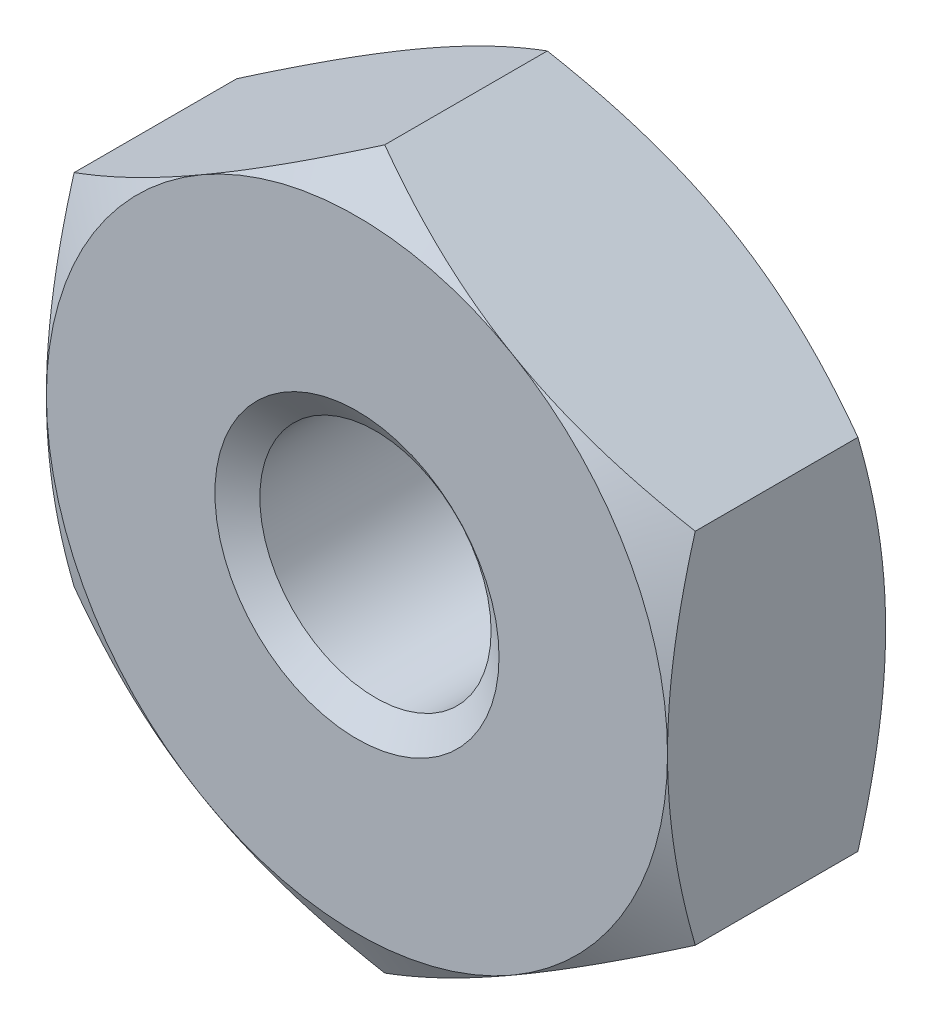
ISO-10303-21;
HEADER;
FILE_DESCRIPTION(('STEP AP214'),'2;1');
FILE_NAME('part.step','',(''),(''),'','','');
FILE_SCHEMA(('AUTOMOTIVE_DESIGN { 1 0 10303 214 1 1 1 1 }'));
ENDSEC;
DATA;
#1=APPLICATION_CONTEXT('core data for automotive mechanical design processes');
#2=APPLICATION_PROTOCOL_DEFINITION('international standard','automotive_design',2000,#1);
#3=PRODUCT_CONTEXT('',#1,'mechanical');
#4=PRODUCT('Part','Part','',(#3));
#5=PRODUCT_RELATED_PRODUCT_CATEGORY('part','',(#4));
#6=PRODUCT_DEFINITION_FORMATION('','',#4);
#7=PRODUCT_DEFINITION_CONTEXT('part definition',#1,'design');
#8=PRODUCT_DEFINITION('design','',#6,#7);
#9=PRODUCT_DEFINITION_SHAPE('','',#8);
#10=(LENGTH_UNIT() NAMED_UNIT(*) SI_UNIT(.MILLI.,.METRE.));
#11=(NAMED_UNIT(*) PLANE_ANGLE_UNIT() SI_UNIT($,.RADIAN.));
#12=(NAMED_UNIT(*) SI_UNIT($,.STERADIAN.) SOLID_ANGLE_UNIT());
#13=UNCERTAINTY_MEASURE_WITH_UNIT(LENGTH_MEASURE(1.E-05),#10,'distance_accuracy_value','');
#14=(GEOMETRIC_REPRESENTATION_CONTEXT(3) GLOBAL_UNCERTAINTY_ASSIGNED_CONTEXT((#13)) GLOBAL_UNIT_ASSIGNED_CONTEXT((#10,
#11,#12)) REPRESENTATION_CONTEXT('',''));
#15=CARTESIAN_POINT('',(0.,0.,0.));
#16=DIRECTION('',(0.,0.,1.));
#17=DIRECTION('',(1.,0.,0.));
#18=AXIS2_PLACEMENT_3D('',#15,#16,#17);
#19=CARTESIAN_POINT('',(0.,0.,-1.6764));
#20=DIRECTION('',(0.,0.,1.));
#21=DIRECTION('',(1.,0.,0.));
#22=AXIS2_PLACEMENT_3D('',#19,#20,#21);
#23=CYLINDRICAL_SURFACE('',#22,0.889);
#24=CARTESIAN_POINT('',(0.,0.,-0.14228217176421));
#25=DIRECTION('',(0.,0.,1.));
#26=DIRECTION('',(1.,0.,0.));
#27=AXIS2_PLACEMENT_3D('',#24,#25,#26);
#28=CIRCLE('',#27,0.889);
#29=CARTESIAN_POINT('',(0.889,0.,-0.14228217176421));
#30=VERTEX_POINT('',#29);
#31=EDGE_CURVE('E173',#30,#30,#28,.F.);
#32=ORIENTED_EDGE('',*,*,#31,.F.);
#33=EDGE_LOOP('',(#32));
#34=FACE_BOUND('',#33,.T.);
#35=CARTESIAN_POINT('',(0.,0.,-1.50871782823579));
#36=DIRECTION('',(0.,0.,-1.));
#37=DIRECTION('',(-1.,0.,0.));
#38=AXIS2_PLACEMENT_3D('',#35,#36,#37);
#39=CIRCLE('',#38,0.889);
#40=CARTESIAN_POINT('',(-0.889,0.,-1.50871782823579));
#41=VERTEX_POINT('',#40);
#42=EDGE_CURVE('E38',#41,#41,#39,.F.);
#43=ORIENTED_EDGE('',*,*,#42,.F.);
#44=EDGE_LOOP('',(#43));
#45=FACE_BOUND('',#44,.T.);
#46=ADVANCED_FACE('F33',(#34,#45),#23,.F.);
#47=CARTESIAN_POINT('',(0.,2.75696300543431,-1.6764));
#48=DIRECTION('',(0.,0.,-1.));
#49=DIRECTION('',(-1.,0.,0.));
#50=AXIS2_PLACEMENT_3D('',#47,#48,#49);
#51=PLANE('',#50);
#52=CARTESIAN_POINT('',(0.,0.,-1.6764));
#53=DIRECTION('',(0.,0.,-1.));
#54=DIRECTION('',(-1.,0.,0.));
#55=AXIS2_PLACEMENT_3D('',#52,#53,#54);
#56=CIRCLE('',#55,2.3876);
#57=CARTESIAN_POINT('',(-2.3876,0.,-1.6764));
#58=VERTEX_POINT('',#57);
#59=CARTESIAN_POINT('',(-1.1938,-2.06772225407572,-1.6764));
#60=VERTEX_POINT('',#59);
#61=EDGE_CURVE('E169',#58,#60,#56,.F.);
#62=ORIENTED_EDGE('',*,*,#61,.F.);
#63=CARTESIAN_POINT('',(-1.19380000000001,2.06772225407572,-1.6764));
#64=VERTEX_POINT('',#63);
#65=EDGE_CURVE('E151',#64,#58,#56,.F.);
#66=ORIENTED_EDGE('',*,*,#65,.F.);
#67=CARTESIAN_POINT('',(1.19380000000001,2.06772225407572,-1.6764));
#68=VERTEX_POINT('',#67);
#69=EDGE_CURVE('E168',#68,#64,#56,.F.);
#70=ORIENTED_EDGE('',*,*,#69,.F.);
#71=CARTESIAN_POINT('',(0.,0.,-1.6764));
#72=DIRECTION('',(0.,0.,1.));
#73=DIRECTION('',(1.,0.,0.));
#74=AXIS2_PLACEMENT_3D('',#71,#72,#73);
#75=CIRCLE('',#74,2.3876);
#76=CARTESIAN_POINT('',(2.3876,0.,-1.6764));
#77=VERTEX_POINT('',#76);
#78=EDGE_CURVE('E243',#77,#68,#75,.T.);
#79=ORIENTED_EDGE('',*,*,#78,.F.);
#80=CARTESIAN_POINT('',(1.19380000000001,-2.06772225407572,-1.6764));
#81=VERTEX_POINT('',#80);
#82=EDGE_CURVE('E375',#81,#77,#56,.F.);
#83=ORIENTED_EDGE('',*,*,#82,.F.);
#84=EDGE_CURVE('E396',#60,#81,#56,.F.);
#85=ORIENTED_EDGE('',*,*,#84,.F.);
#86=EDGE_LOOP('',(#62,#66,#70,#79,#83,#85));
#87=FACE_BOUND('',#86,.T.);
#88=CARTESIAN_POINT('',(0.,0.,-1.6764));
#89=DIRECTION('',(0.,0.,-1.));
#90=DIRECTION('',(-1.,0.,0.));
#91=AXIS2_PLACEMENT_3D('',#88,#89,#90);
#92=CIRCLE('',#91,1.0922);
#93=CARTESIAN_POINT('',(-1.0922,0.,-1.6764));
#94=VERTEX_POINT('',#93);
#95=EDGE_CURVE('E176',#94,#94,#92,.F.);
#96=ORIENTED_EDGE('',*,*,#95,.T.);
#97=EDGE_LOOP('',(#96));
#98=FACE_BOUND('',#97,.T.);
#99=ADVANCED_FACE('F248',(#87,#98),#51,.T.);
#100=CARTESIAN_POINT('',(0.,2.75696300543431,0.));
#101=DIRECTION('',(0.,0.,-1.));
#102=DIRECTION('',(-1.,0.,0.));
#103=AXIS2_PLACEMENT_3D('',#100,#101,#102);
#104=PLANE('',#103);
#105=CARTESIAN_POINT('',(0.,0.,0.));
#106=DIRECTION('',(0.,0.,-1.));
#107=DIRECTION('',(-1.,0.,0.));
#108=AXIS2_PLACEMENT_3D('',#105,#106,#107);
#109=CIRCLE('',#108,2.3876);
#110=CARTESIAN_POINT('',(-2.3876,0.,0.));
#111=VERTEX_POINT('',#110);
#112=CARTESIAN_POINT('',(-1.19380000000001,2.06772225407572,0.));
#113=VERTEX_POINT('',#112);
#114=EDGE_CURVE('E11',#111,#113,#109,.T.);
#115=ORIENTED_EDGE('',*,*,#114,.F.);
#116=CARTESIAN_POINT('',(-1.1938,-2.06772225407572,0.));
#117=VERTEX_POINT('',#116);
#118=EDGE_CURVE('E45',#117,#111,#109,.T.);
#119=ORIENTED_EDGE('',*,*,#118,.F.);
#120=CARTESIAN_POINT('',(1.19380000000001,-2.06772225407572,0.));
#121=VERTEX_POINT('',#120);
#122=EDGE_CURVE('E172',#121,#117,#109,.T.);
#123=ORIENTED_EDGE('',*,*,#122,.F.);
#124=CARTESIAN_POINT('',(2.3876,0.,0.));
#125=VERTEX_POINT('',#124);
#126=EDGE_CURVE('E341',#125,#121,#109,.T.);
#127=ORIENTED_EDGE('',*,*,#126,.F.);
#128=CARTESIAN_POINT('',(0.,0.,0.));
#129=DIRECTION('',(0.,0.,1.));
#130=DIRECTION('',(1.,0.,0.));
#131=AXIS2_PLACEMENT_3D('',#128,#129,#130);
#132=CIRCLE('',#131,2.3876);
#133=CARTESIAN_POINT('',(1.19380000000001,2.06772225407572,0.));
#134=VERTEX_POINT('',#133);
#135=EDGE_CURVE('E127',#125,#134,#132,.T.);
#136=ORIENTED_EDGE('',*,*,#135,.T.);
#137=EDGE_CURVE('E43',#113,#134,#109,.T.);
#138=ORIENTED_EDGE('',*,*,#137,.F.);
#139=EDGE_LOOP('',(#115,#119,#123,#127,#136,#138));
#140=FACE_BOUND('',#139,.T.);
#141=CARTESIAN_POINT('',(0.,0.,0.));
#142=DIRECTION('',(0.,0.,1.));
#143=DIRECTION('',(1.,0.,0.));
#144=AXIS2_PLACEMENT_3D('',#141,#142,#143);
#145=CIRCLE('',#144,1.0922);
#146=CARTESIAN_POINT('',(1.0922,0.,0.));
#147=VERTEX_POINT('',#146);
#148=EDGE_CURVE('E175',#147,#147,#145,.T.);
#149=ORIENTED_EDGE('',*,*,#148,.F.);
#150=EDGE_LOOP('',(#149));
#151=FACE_BOUND('',#150,.T.);
#152=ADVANCED_FACE('F300',(#140,#151),#104,.F.);
#153=CARTESIAN_POINT('',(0.,2.75696300543431,-1.6764));
#154=DIRECTION('',(-0.500000000000004,0.866025403784436,0.));
#155=DIRECTION('',(-0.866025403784436,-0.500000000000004,0.));
#156=AXIS2_PLACEMENT_3D('',#153,#154,#155);
#157=PLANE('',#156);
#158=DIRECTION('',(0.,0.,1.));
#159=VECTOR('',#158,1.);
#160=CARTESIAN_POINT('',(-2.3876,1.37848150271714,-1.6764));
#161=LINE('',#160,#159);
#162=CARTESIAN_POINT('',(-2.3876,1.37848150271716,-1.46314816938381));
#163=VERTEX_POINT('',#162);
#164=CARTESIAN_POINT('',(-2.3876,1.37848150271714,-0.213251830616181));
#165=VERTEX_POINT('',#164);
#166=EDGE_CURVE('E163',#163,#165,#161,.T.);
#167=ORIENTED_EDGE('',*,*,#166,.T.);
#168=CARTESIAN_POINT('',(-2.3878,1.3783660326633,-0.213318501470979));
#169=CARTESIAN_POINT('',(-2.28287606453564,1.43894389504809,-0.178329367585888));
#170=CARTESIAN_POINT('',(-2.17704643460647,1.50004466037593,-0.146507745229369));
#171=CARTESIAN_POINT('',(-1.96355453037943,1.62330426875122,-0.0909621397075383));
#172=CARTESIAN_POINT('',(-1.85588846194031,1.68546530234714,-0.0672578076475622));
#173=CARTESIAN_POINT('',(-1.64189067804026,1.80901698048781,-0.0303576796709481));
#174=CARTESIAN_POINT('',(-1.53559189340191,1.8703886124133,-0.0169163088441156));
#175=CARTESIAN_POINT('',(-1.32249401746025,1.99342072845196,-0.000868578218158919));
#176=CARTESIAN_POINT('',(-1.21569570098293,2.05508076521913,0.00175106886924208));
#177=CARTESIAN_POINT('',(-1.01612814269019,2.17030114872096,-0.00369159153788402));
#178=CARTESIAN_POINT('',(-0.923329063406968,2.22387872212568,-0.0104175391417704));
#179=CARTESIAN_POINT('',(-0.738335505406029,2.33068480263587,-0.0317370557583221));
#180=CARTESIAN_POINT('',(-0.646141666797156,2.38391294017433,-0.0463379112564599));
#181=CARTESIAN_POINT('',(-0.460766524191895,2.49093932865855,-0.0828397901525214));
#182=CARTESIAN_POINT('',(-0.367608688702193,2.54472403005565,-0.104895581600362));
#183=CARTESIAN_POINT('',(-0.182682641216108,2.65149113335191,-0.154953888652165));
#184=CARTESIAN_POINT('',(-0.0909120590697554,2.7044749036578,-0.182944638241838));
#185=CARTESIAN_POINT('',(0.000199999999998261,2.75707847548814,-0.213318501470984));
#186=B_SPLINE_CURVE_WITH_KNOTS('',3,(#168,#169,#170,#171,#172,#173,#174,#175,#176,#177,#178,
#179,#180,#181,#182,#183,#184,#185),.UNSPECIFIED.,.F.,.F.,(4,2,2,2,2,2,2,2,4),(0.,
0.378469527554648,0.757848917720108,1.12783830118146,1.49737326355505,1.81916504067612,
2.14125507699893,2.47049068028368,2.79907957904289),.UNSPECIFIED.);
#187=EDGE_CURVE('E132',#165,#113,#186,.T.);
#188=ORIENTED_EDGE('',*,*,#187,.T.);
#189=CARTESIAN_POINT('',(0.,2.75696300543431,-0.213251830616187));
#190=VERTEX_POINT('',#189);
#191=EDGE_CURVE('E52',#113,#190,#186,.T.);
#192=ORIENTED_EDGE('',*,*,#191,.T.);
#193=DIRECTION('',(0.,0.,1.));
#194=VECTOR('',#193,1.);
#195=CARTESIAN_POINT('',(0.,2.75696300543431,-1.6764));
#196=LINE('',#195,#194);
#197=CARTESIAN_POINT('',(0.,2.75696300543431,-1.46314816938381));
#198=VERTEX_POINT('',#197);
#199=EDGE_CURVE('E148',#198,#190,#196,.T.);
#200=ORIENTED_EDGE('',*,*,#199,.F.);
#201=CARTESIAN_POINT('',(-2.3878,1.3783660326633,-1.46308149852902));
#202=CARTESIAN_POINT('',(-2.28287606453564,1.43894389504809,-1.49807063241411));
#203=CARTESIAN_POINT('',(-2.17704643460647,1.50004466037593,-1.52989225477063));
#204=CARTESIAN_POINT('',(-1.96355453037943,1.62330426875122,-1.58543786029246));
#205=CARTESIAN_POINT('',(-1.85588846194031,1.68546530234714,-1.60914219235244));
#206=CARTESIAN_POINT('',(-1.64189067804026,1.80901698048781,-1.64604232032905));
#207=CARTESIAN_POINT('',(-1.53559189340191,1.8703886124133,-1.65948369115588));
#208=CARTESIAN_POINT('',(-1.32249401746025,1.99342072845196,-1.67553142178184));
#209=CARTESIAN_POINT('',(-1.21569570098293,2.05508076521913,-1.67815106886924));
#210=CARTESIAN_POINT('',(-1.01612814269019,2.17030114872096,-1.67270840846212));
#211=CARTESIAN_POINT('',(-0.923329063406969,2.22387872212568,-1.66598246085823));
#212=CARTESIAN_POINT('',(-0.73833550540603,2.33068480263587,-1.64466294424168));
#213=CARTESIAN_POINT('',(-0.646141666797157,2.38391294017433,-1.63006208874354));
#214=CARTESIAN_POINT('',(-0.460766524191895,2.49093932865855,-1.59356020984748));
#215=CARTESIAN_POINT('',(-0.367608688702193,2.54472403005565,-1.57150441839964));
#216=CARTESIAN_POINT('',(-0.182682641216109,2.65149113335191,-1.52144611134783));
#217=CARTESIAN_POINT('',(-0.0909120590697563,2.7044749036578,-1.49345536175816));
#218=CARTESIAN_POINT('',(0.000199999999997863,2.75707847548814,-1.46308149852902));
#219=B_SPLINE_CURVE_WITH_KNOTS('',3,(#201,#202,#203,#204,#205,#206,#207,#208,#209,#210,#211,
#212,#213,#214,#215,#216,#217,#218),.UNSPECIFIED.,.F.,.F.,(4,2,2,2,2,2,2,2,4),(0.,
0.378469527554648,0.757848917720108,1.12783830118146,1.49737326355505,1.81916504067612,
2.14125507699893,2.47049068028368,2.79907957904288),.UNSPECIFIED.);
#220=EDGE_CURVE('E166',#64,#198,#219,.T.);
#221=ORIENTED_EDGE('',*,*,#220,.F.);
#222=EDGE_CURVE('E258',#163,#64,#219,.T.);
#223=ORIENTED_EDGE('',*,*,#222,.F.);
#224=EDGE_LOOP('',(#167,#188,#192,#200,#221,#223));
#225=FACE_BOUND('',#224,.T.);
#226=ADVANCED_FACE('F35',(#225),#157,.T.);
#227=CARTESIAN_POINT('',(2.3876,1.37848150271715,-1.6764));
#228=DIRECTION('',(0.500000000000003,0.866025403784437,0.));
#229=DIRECTION('',(-0.866025403784437,0.500000000000003,0.));
#230=AXIS2_PLACEMENT_3D('',#227,#228,#229);
#231=PLANE('',#230);
#232=ORIENTED_EDGE('',*,*,#199,.T.);
#233=CARTESIAN_POINT('',(-0.000200000000001865,2.75707847548814,-0.213318501470985));
#234=CARTESIAN_POINT('',(0.104723935464362,2.69650061310336,-0.178329367585893));
#235=CARTESIAN_POINT('',(0.21055356539353,2.63539984777552,-0.146507745229374));
#236=CARTESIAN_POINT('',(0.424045469620568,2.51214023940023,-0.0909621397075422));
#237=CARTESIAN_POINT('',(0.531711538059694,2.44997920580431,-0.0672578076475657));
#238=CARTESIAN_POINT('',(0.745709321959737,2.32642752766364,-0.0303576796709507));
#239=CARTESIAN_POINT('',(0.852008106598094,2.26505589573815,-0.0169163088441176));
#240=CARTESIAN_POINT('',(1.06510598253976,2.14202377969949,-0.000868578218159751));
#241=CARTESIAN_POINT('',(1.17190429901707,2.08036374293232,0.00175106886924188));
#242=CARTESIAN_POINT('',(1.37147185730981,1.96514335943049,-0.00369159153788347));
#243=CARTESIAN_POINT('',(1.46427093659303,1.91156578602577,-0.0104175391417696));
#244=CARTESIAN_POINT('',(1.64926449459397,1.80475970551558,-0.0317370557583205));
#245=CARTESIAN_POINT('',(1.74145833320285,1.75153156797712,-0.0463379112564577));
#246=CARTESIAN_POINT('',(1.92683347580811,1.64450517949291,-0.0828397901525183));
#247=CARTESIAN_POINT('',(2.01999131129781,1.5907204780958,-0.104895581600359));
#248=CARTESIAN_POINT('',(2.20491735878389,1.48395337479954,-0.154953888652161));
#249=CARTESIAN_POINT('',(2.29668794093025,1.43096960449365,-0.182944638241834));
#250=CARTESIAN_POINT('',(2.3878,1.37836603266331,-0.213318501470979));
#251=B_SPLINE_CURVE_WITH_KNOTS('',3,(#233,#234,#235,#236,#237,#238,#239,#240,#241,#242,#243,
#244,#245,#246,#247,#248,#249,#250),.UNSPECIFIED.,.F.,.F.,(4,2,2,2,2,2,2,2,4),(0.,
0.378469527554649,0.757848917720111,1.12783830118146,1.49737326355505,1.81916504067612,
2.14125507699893,2.47049068028368,2.79907957904288),.UNSPECIFIED.);
#252=EDGE_CURVE('E142',#190,#134,#251,.T.);
#253=ORIENTED_EDGE('',*,*,#252,.T.);
#254=CARTESIAN_POINT('',(2.3876,1.37848150271717,-0.213251830616187));
#255=VERTEX_POINT('',#254);
#256=EDGE_CURVE('E59',#134,#255,#251,.T.);
#257=ORIENTED_EDGE('',*,*,#256,.T.);
#258=DIRECTION('',(0.,0.,1.));
#259=VECTOR('',#258,1.);
#260=CARTESIAN_POINT('',(2.3876,1.37848150271715,-1.6764));
#261=LINE('',#260,#259);
#262=CARTESIAN_POINT('',(2.3876,1.37848150271717,-1.46314816938381));
#263=VERTEX_POINT('',#262);
#264=EDGE_CURVE('E141',#263,#255,#261,.T.);
#265=ORIENTED_EDGE('',*,*,#264,.F.);
#266=CARTESIAN_POINT('',(-0.000200000000001872,2.75707847548814,-1.46308149852902));
#267=CARTESIAN_POINT('',(0.104723935464362,2.69650061310336,-1.49807063241411));
#268=CARTESIAN_POINT('',(0.21055356539353,2.63539984777552,-1.52989225477063));
#269=CARTESIAN_POINT('',(0.424045469620568,2.51214023940023,-1.58543786029246));
#270=CARTESIAN_POINT('',(0.531711538059694,2.44997920580431,-1.60914219235243));
#271=CARTESIAN_POINT('',(0.745709321959737,2.32642752766364,-1.64604232032905));
#272=CARTESIAN_POINT('',(0.852008106598094,2.26505589573815,-1.65948369115588));
#273=CARTESIAN_POINT('',(1.06510598253976,2.14202377969949,-1.67553142178184));
#274=CARTESIAN_POINT('',(1.17190429901707,2.08036374293232,-1.67815106886924));
#275=CARTESIAN_POINT('',(1.37147185730981,1.96514335943049,-1.67270840846212));
#276=CARTESIAN_POINT('',(1.46427093659303,1.91156578602577,-1.66598246085823));
#277=CARTESIAN_POINT('',(1.64926449459397,1.80475970551558,-1.64466294424168));
#278=CARTESIAN_POINT('',(1.74145833320285,1.75153156797712,-1.63006208874354));
#279=CARTESIAN_POINT('',(1.92683347580811,1.64450517949291,-1.59356020984748));
#280=CARTESIAN_POINT('',(2.01999131129781,1.5907204780958,-1.57150441839964));
#281=CARTESIAN_POINT('',(2.20491735878389,1.48395337479954,-1.52144611134784));
#282=CARTESIAN_POINT('',(2.29668794093025,1.43096960449365,-1.49345536175817));
#283=CARTESIAN_POINT('',(2.3878,1.37836603266331,-1.46308149852902));
#284=B_SPLINE_CURVE_WITH_KNOTS('',3,(#266,#267,#268,#269,#270,#271,#272,#273,#274,#275,#276,
#277,#278,#279,#280,#281,#282,#283),.UNSPECIFIED.,.F.,.F.,(4,2,2,2,2,2,2,2,4),(0.,
0.378469527554649,0.757848917720111,1.12783830118146,1.49737326355505,1.81916504067612,
2.14125507699893,2.47049068028368,2.79907957904288),.UNSPECIFIED.);
#285=EDGE_CURVE('E252',#68,#263,#284,.T.);
#286=ORIENTED_EDGE('',*,*,#285,.F.);
#287=EDGE_CURVE('E257',#198,#68,#284,.T.);
#288=ORIENTED_EDGE('',*,*,#287,.F.);
#289=EDGE_LOOP('',(#232,#253,#257,#265,#286,#288));
#290=FACE_BOUND('',#289,.T.);
#291=ADVANCED_FACE('F139',(#290),#231,.T.);
#292=CARTESIAN_POINT('',(2.3876,1.37848150271715,-1.6764));
#293=DIRECTION('',(-1.,0.,0.));
#294=DIRECTION('',(0.,0.,1.));
#295=AXIS2_PLACEMENT_3D('',#292,#293,#294);
#296=PLANE('',#295);
#297=CARTESIAN_POINT('',(2.3876,-3.65593609080649,-1.14253036159854));
#298=CARTESIAN_POINT('',(2.3876,-3.55110694918386,-1.09187113002077));
#299=CARTESIAN_POINT('',(2.3876,-3.44602995685677,-1.04171549313264));
#300=CARTESIAN_POINT('',(2.3876,-3.23524625803962,-0.942699180123231));
#301=CARTESIAN_POINT('',(2.3876,-3.12953944635139,-0.893838728210004));
#302=CARTESIAN_POINT('',(2.3876,-2.91679107639573,-0.797443156999656));
#303=CARTESIAN_POINT('',(2.3876,-2.80974534161061,-0.74991722213313));
#304=CARTESIAN_POINT('',(2.3876,-2.59477405010642,-0.656906706437378));
#305=CARTESIAN_POINT('',(2.3876,-2.48684853959578,-0.61142201920174));
#306=CARTESIAN_POINT('',(2.3876,-2.26860623456078,-0.522496803220397));
#307=CARTESIAN_POINT('',(2.3876,-2.15827634925912,-0.47908822594844));
#308=CARTESIAN_POINT('',(2.3876,-1.93631522811917,-0.39567082225968));
#309=CARTESIAN_POINT('',(2.3876,-1.82468384906324,-0.355662374089448));
#310=CARTESIAN_POINT('',(2.3876,-1.60017141965676,-0.280120244638395));
#311=CARTESIAN_POINT('',(2.3876,-1.487293603322,-0.244577050022474));
#312=CARTESIAN_POINT('',(2.3876,-1.2599332647214,-0.179119755521417));
#313=CARTESIAN_POINT('',(2.3876,-1.14545126227174,-0.149203875516054));
#314=CARTESIAN_POINT('',(2.3876,-0.914804359975561,-0.0964535455080679));
#315=CARTESIAN_POINT('',(2.3876,-0.798639020636922,-0.073620981027459));
#316=CARTESIAN_POINT('',(2.3876,-0.564907787073333,-0.0365745914220466));
#317=CARTESIAN_POINT('',(2.3876,-0.447341891610209,-0.0223607739172987));
#318=CARTESIAN_POINT('',(2.3876,-0.212169292608925,-0.00380930426889783));
#319=CARTESIAN_POINT('',(2.3876,-0.0945676495920211,0.000590871764266419));
#320=CARTESIAN_POINT('',(2.3876,0.140553287899092,-0.000718707219114432));
#321=CARTESIAN_POINT('',(2.3876,0.25807259582575,-0.00642583790168169));
#322=CARTESIAN_POINT('',(2.3876,0.458753843166105,-0.024400516690851));
#323=CARTESIAN_POINT('',(2.3876,0.542137181712102,-0.0343272988086084));
#324=CARTESIAN_POINT('',(2.3876,0.708259747560009,-0.0586235846359388));
#325=CARTESIAN_POINT('',(2.3876,0.790998871167442,-0.0729937890101849));
#326=CARTESIAN_POINT('',(2.3876,1.03818247230877,-0.122015355850191));
#327=CARTESIAN_POINT('',(2.3876,1.20146831776594,-0.162565050307172));
#328=CARTESIAN_POINT('',(2.3876,1.44580075224368,-0.232502314876436));
#329=CARTESIAN_POINT('',(2.3876,1.52812092254202,-0.257690051867363));
#330=CARTESIAN_POINT('',(2.3876,1.69190206167627,-0.310557865937949));
#331=CARTESIAN_POINT('',(2.3876,1.773363580432,-0.338236223967965));
#332=CARTESIAN_POINT('',(2.3876,1.93508677044203,-0.39550934184071));
#333=CARTESIAN_POINT('',(2.3876,2.01535261438467,-0.425092437982261));
#334=CARTESIAN_POINT('',(2.3876,2.17526154662173,-0.485994997377667));
#335=CARTESIAN_POINT('',(2.3876,2.25490436816689,-0.517315162412031));
#336=CARTESIAN_POINT('',(2.3876,2.33425921925151,-0.549332446004792));
#337=B_SPLINE_CURVE_WITH_KNOTS('',3,(#297,#298,#299,#300,#301,#302,#303,#304,#305,#306,#307,
#308,#309,#310,#311,#312,#313,#314,#315,#316,#317,#318,#319,#320,#321,#322,#323,#324,#325,#326,
#327,#328,#329,#330,#331,#332,#333,#334,#335,#336),.UNSPECIFIED.,.F.,.F.,(4,2,2,2,2,2,2,2,2,2,2,
2,2,2,2,2,2,2,2,4),(0.,0.349289042962513,0.698638161244703,1.04998646344191,1.40131642918613,
1.75695963655398,2.1126423557206,2.46755394737998,2.82235307834569,3.17724657312797,
3.53214038168024,3.88476658086275,4.23730123505986,4.48909473258754,4.74092795464398,
5.24496920192682,5.50321076764731,5.76127544014718,6.01788755129246,6.27460410049568),.UNSPECIFIED.);
#338=CARTESIAN_POINT('',(2.3876,-1.37848150271716,-0.213251830616187));
#339=VERTEX_POINT('',#338);
#340=EDGE_CURVE('E134',#339,#125,#337,.T.);
#341=ORIENTED_EDGE('',*,*,#340,.F.);
#342=DIRECTION('',(0.,0.,1.));
#343=VECTOR('',#342,1.);
#344=CARTESIAN_POINT('',(2.3876,-1.37848150271716,-1.6764));
#345=LINE('',#344,#343);
#346=CARTESIAN_POINT('',(2.3876,-1.37848150271716,-1.46314816938381));
#347=VERTEX_POINT('',#346);
#348=EDGE_CURVE('E149',#347,#339,#345,.T.);
#349=ORIENTED_EDGE('',*,*,#348,.F.);
#350=CARTESIAN_POINT('',(2.3876,-3.65593609080648,-0.533869638401462));
#351=CARTESIAN_POINT('',(2.3876,-3.55110694918386,-0.584528869979238));
#352=CARTESIAN_POINT('',(2.3876,-3.44602995685677,-0.634684506867364));
#353=CARTESIAN_POINT('',(2.3876,-3.23524625803961,-0.733700819876772));
#354=CARTESIAN_POINT('',(2.3876,-3.12953944635139,-0.782561271789999));
#355=CARTESIAN_POINT('',(2.3876,-2.91679107639573,-0.878956843000347));
#356=CARTESIAN_POINT('',(2.3876,-2.80974534161061,-0.926482777866872));
#357=CARTESIAN_POINT('',(2.3876,-2.59477405010642,-1.01949329356262));
#358=CARTESIAN_POINT('',(2.3876,-2.48684853959578,-1.06497798079826));
#359=CARTESIAN_POINT('',(2.3876,-2.26860623456078,-1.1539031967796));
#360=CARTESIAN_POINT('',(2.3876,-2.15827634925912,-1.19731177405156));
#361=CARTESIAN_POINT('',(2.3876,-1.93631522811917,-1.28072917774032));
#362=CARTESIAN_POINT('',(2.3876,-1.82468384906324,-1.32073762591055));
#363=CARTESIAN_POINT('',(2.3876,-1.60017141965676,-1.39627975536161));
#364=CARTESIAN_POINT('',(2.3876,-1.487293603322,-1.43182294997753));
#365=CARTESIAN_POINT('',(2.3876,-1.2599332647214,-1.49728024447858));
#366=CARTESIAN_POINT('',(2.3876,-1.14545126227174,-1.52719612448395));
#367=CARTESIAN_POINT('',(2.3876,-0.914804359975561,-1.57994645449193));
#368=CARTESIAN_POINT('',(2.3876,-0.798639020636922,-1.60277901897254));
#369=CARTESIAN_POINT('',(2.3876,-0.564907787073333,-1.63982540857795));
#370=CARTESIAN_POINT('',(2.3876,-0.447341891610209,-1.6540392260827));
#371=CARTESIAN_POINT('',(2.3876,-0.212169292608925,-1.6725906957311));
#372=CARTESIAN_POINT('',(2.3876,-0.0945676495920214,-1.67699087176427));
#373=CARTESIAN_POINT('',(2.3876,0.140553287899092,-1.67568129278089));
#374=CARTESIAN_POINT('',(2.3876,0.258072595825749,-1.66997416209832));
#375=CARTESIAN_POINT('',(2.3876,0.458753843166105,-1.65199948330915));
#376=CARTESIAN_POINT('',(2.3876,0.542137181712102,-1.64207270119139));
#377=CARTESIAN_POINT('',(2.3876,0.708259747560009,-1.61777641536406));
#378=CARTESIAN_POINT('',(2.3876,0.790998871167442,-1.60340621098982));
#379=CARTESIAN_POINT('',(2.3876,1.03818247230877,-1.55438464414981));
#380=CARTESIAN_POINT('',(2.3876,1.20146831776594,-1.51383494969283));
#381=CARTESIAN_POINT('',(2.3876,1.44580075224369,-1.44389768512356));
#382=CARTESIAN_POINT('',(2.3876,1.52812092254202,-1.41870994813264));
#383=CARTESIAN_POINT('',(2.3876,1.69190206167627,-1.36584213406205));
#384=CARTESIAN_POINT('',(2.3876,1.77336358043201,-1.33816377603203));
#385=CARTESIAN_POINT('',(2.3876,1.93508677044203,-1.28089065815929));
#386=CARTESIAN_POINT('',(2.3876,2.01535261438467,-1.25130756201774));
#387=CARTESIAN_POINT('',(2.3876,2.17526154662174,-1.19040500262233));
#388=CARTESIAN_POINT('',(2.3876,2.2549043681669,-1.15908483758797));
#389=CARTESIAN_POINT('',(2.3876,2.33425921925151,-1.12706755399521));
#390=B_SPLINE_CURVE_WITH_KNOTS('',3,(#350,#351,#352,#353,#354,#355,#356,#357,#358,#359,#360,
#361,#362,#363,#364,#365,#366,#367,#368,#369,#370,#371,#372,#373,#374,#375,#376,#377,#378,#379,
#380,#381,#382,#383,#384,#385,#386,#387,#388,#389),.UNSPECIFIED.,.F.,.F.,(4,2,2,2,2,2,2,2,2,2,2,
2,2,2,2,2,2,2,2,4),(0.,0.349289042962513,0.698638161244704,1.04998646344191,1.40131642918613,
1.75695963655398,2.1126423557206,2.46755394737998,2.82235307834569,3.17724657312797,
3.53214038168024,3.88476658086274,4.23730123505986,4.48909473258754,4.74092795464398,
5.24496920192682,5.50321076764731,5.76127544014718,6.01788755129247,6.27460410049569),.UNSPECIFIED.);
#391=EDGE_CURVE('E264',#347,#77,#390,.T.);
#392=ORIENTED_EDGE('',*,*,#391,.T.);
#393=EDGE_CURVE('E147',#77,#263,#390,.T.);
#394=ORIENTED_EDGE('',*,*,#393,.T.);
#395=ORIENTED_EDGE('',*,*,#264,.T.);
#396=EDGE_CURVE('E124',#125,#255,#337,.T.);
#397=ORIENTED_EDGE('',*,*,#396,.F.);
#398=EDGE_LOOP('',(#341,#349,#392,#394,#395,#397));
#399=FACE_BOUND('',#398,.T.);
#400=ADVANCED_FACE('F145',(#399),#296,.F.);
#401=CARTESIAN_POINT('',(0.,-2.75696300543432,-1.6764));
#402=DIRECTION('',(0.500000000000004,-0.866025403784436,0.));
#403=DIRECTION('',(0.866025403784437,0.500000000000004,0.));
#404=AXIS2_PLACEMENT_3D('',#401,#402,#403);
#405=PLANE('',#404);
#406=ORIENTED_EDGE('',*,*,#348,.T.);
#407=CARTESIAN_POINT('',(2.3878,-1.37836603266332,-0.213318501470983));
#408=CARTESIAN_POINT('',(2.28287606453563,-1.43894389504811,-0.178329367585892));
#409=CARTESIAN_POINT('',(2.17704643460647,-1.50004466037595,-0.146507745229374));
#410=CARTESIAN_POINT('',(1.96355453037943,-1.62330426875124,-0.0909621397075434));
#411=CARTESIAN_POINT('',(1.8558884619403,-1.68546530234716,-0.0672578076475677));
#412=CARTESIAN_POINT('',(1.64189067804026,-1.80901698048783,-0.0303576796709542));
#413=CARTESIAN_POINT('',(1.5355918934019,-1.87038861241332,-0.016916308844122));
#414=CARTESIAN_POINT('',(1.32249401746024,-1.99342072845198,-0.000868578218165913));
#415=CARTESIAN_POINT('',(1.21569570098293,-2.05508076521915,0.00175106886923473));
#416=CARTESIAN_POINT('',(1.01612814269019,-2.17030114872098,-0.003691591537892));
#417=CARTESIAN_POINT('',(0.923329063406963,-2.2238787221257,-0.0104175391417786));
#418=CARTESIAN_POINT('',(0.738335505406025,-2.33068480263589,-0.0317370557583306));
#419=CARTESIAN_POINT('',(0.646141666797152,-2.38391294017435,-0.0463379112564686));
#420=CARTESIAN_POINT('',(0.460766524191892,-2.49093932865856,-0.0828397901525303));
#421=CARTESIAN_POINT('',(0.36760868870219,-2.54472403005567,-0.104895581600371));
#422=CARTESIAN_POINT('',(0.182682641216107,-2.65149113335193,-0.154953888652174));
#423=CARTESIAN_POINT('',(0.0909120590697544,-2.70447490365782,-0.182944638241847));
#424=CARTESIAN_POINT('',(-0.000199999999999159,-2.75707847548816,-0.213318501470993));
#425=B_SPLINE_CURVE_WITH_KNOTS('',3,(#407,#408,#409,#410,#411,#412,#413,#414,#415,#416,#417,
#418,#419,#420,#421,#422,#423,#424),.UNSPECIFIED.,.F.,.F.,(4,2,2,2,2,2,2,2,4),(0.,
0.378469527554649,0.75784891772011,1.12783830118146,1.49737326355505,1.81916504067612,
2.14125507699893,2.47049068028368,2.79907957904288),.UNSPECIFIED.);
#426=EDGE_CURVE('E344',#339,#121,#425,.T.);
#427=ORIENTED_EDGE('',*,*,#426,.T.);
#428=CARTESIAN_POINT('',(0.,-2.75696300543431,-0.213251830616187));
#429=VERTEX_POINT('',#428);
#430=EDGE_CURVE('E224',#121,#429,#425,.T.);
#431=ORIENTED_EDGE('',*,*,#430,.T.);
#432=DIRECTION('',(0.,0.,1.));
#433=VECTOR('',#432,1.);
#434=CARTESIAN_POINT('',(0.,-2.75696300543432,-1.6764));
#435=LINE('',#434,#433);
#436=CARTESIAN_POINT('',(0.,-2.75696300543431,-1.46314816938381));
#437=VERTEX_POINT('',#436);
#438=EDGE_CURVE('E154',#437,#429,#435,.T.);
#439=ORIENTED_EDGE('',*,*,#438,.F.);
#440=CARTESIAN_POINT('',(2.3878,-1.37836603266332,-1.46308149852902));
#441=CARTESIAN_POINT('',(2.28287606453563,-1.43894389504811,-1.49807063241411));
#442=CARTESIAN_POINT('',(2.17704643460647,-1.50004466037595,-1.52989225477063));
#443=CARTESIAN_POINT('',(1.96355453037943,-1.62330426875124,-1.58543786029246));
#444=CARTESIAN_POINT('',(1.8558884619403,-1.68546530234716,-1.60914219235243));
#445=CARTESIAN_POINT('',(1.64189067804026,-1.80901698048783,-1.64604232032905));
#446=CARTESIAN_POINT('',(1.5355918934019,-1.87038861241332,-1.65948369115588));
#447=CARTESIAN_POINT('',(1.32249401746024,-1.99342072845197,-1.67553142178183));
#448=CARTESIAN_POINT('',(1.21569570098293,-2.05508076521915,-1.67815106886923));
#449=CARTESIAN_POINT('',(1.01612814269019,-2.17030114872098,-1.67270840846211));
#450=CARTESIAN_POINT('',(0.923329063406964,-2.2238787221257,-1.66598246085822));
#451=CARTESIAN_POINT('',(0.738335505406026,-2.33068480263589,-1.64466294424167));
#452=CARTESIAN_POINT('',(0.646141666797153,-2.38391294017435,-1.63006208874353));
#453=CARTESIAN_POINT('',(0.460766524191892,-2.49093932865856,-1.59356020984747));
#454=CARTESIAN_POINT('',(0.367608688702191,-2.54472403005567,-1.57150441839963));
#455=CARTESIAN_POINT('',(0.182682641216107,-2.65149113335193,-1.52144611134783));
#456=CARTESIAN_POINT('',(0.0909120590697543,-2.70447490365782,-1.49345536175815));
#457=CARTESIAN_POINT('',(-0.000199999999999634,-2.75707847548816,-1.46308149852901));
#458=B_SPLINE_CURVE_WITH_KNOTS('',3,(#440,#441,#442,#443,#444,#445,#446,#447,#448,#449,#450,
#451,#452,#453,#454,#455,#456,#457),.UNSPECIFIED.,.F.,.F.,(4,2,2,2,2,2,2,2,4),(0.,
0.378469527554648,0.75784891772011,1.12783830118146,1.49737326355505,1.81916504067612,
2.14125507699893,2.47049068028368,2.79907957904288),.UNSPECIFIED.);
#459=EDGE_CURVE('E270',#81,#437,#458,.T.);
#460=ORIENTED_EDGE('',*,*,#459,.F.);
#461=EDGE_CURVE('E269',#347,#81,#458,.T.);
#462=ORIENTED_EDGE('',*,*,#461,.F.);
#463=EDGE_LOOP('',(#406,#427,#431,#439,#460,#462));
#464=FACE_BOUND('',#463,.T.);
#465=ADVANCED_FACE('F280',(#464),#405,.T.);
#466=CARTESIAN_POINT('',(-2.3876,-1.37848150271716,-1.6764));
#467=DIRECTION('',(-0.500000000000002,-0.866025403784437,0.));
#468=DIRECTION('',(0.866025403784438,-0.500000000000002,0.));
#469=AXIS2_PLACEMENT_3D('',#466,#467,#468);
#470=PLANE('',#469);
#471=ORIENTED_EDGE('',*,*,#438,.T.);
#472=CARTESIAN_POINT('',(0.000200000000000635,-2.75707847548816,-0.213318501470993));
#473=CARTESIAN_POINT('',(-0.104723935464364,-2.69650061310337,-0.178329367585902));
#474=CARTESIAN_POINT('',(-0.210553565393532,-2.63539984777553,-0.146507745229383));
#475=CARTESIAN_POINT('',(-0.424045469620571,-2.51214023940024,-0.0909621397075506));
#476=CARTESIAN_POINT('',(-0.531711538059699,-2.44997920580432,-0.0672578076475739));
#477=CARTESIAN_POINT('',(-0.745709321959743,-2.32642752766365,-0.0303576796709588));
#478=CARTESIAN_POINT('',(-0.852008106598101,-2.26505589573816,-0.0169163088441256));
#479=CARTESIAN_POINT('',(-1.06510598253976,-2.1420237796995,-0.000868578218168017));
#480=CARTESIAN_POINT('',(-1.17190429901708,-2.08036374293233,0.00175106886923329));
#481=CARTESIAN_POINT('',(-1.37147185730982,-1.9651433594305,-0.00369159153789224));
#482=CARTESIAN_POINT('',(-1.46427093659304,-1.91156578602578,-0.0104175391417782));
#483=CARTESIAN_POINT('',(-1.64926449459398,-1.80475970551559,-0.0317370557583288));
#484=CARTESIAN_POINT('',(-1.74145833320285,-1.75153156797713,-0.0463379112564659));
#485=CARTESIAN_POINT('',(-1.92683347580811,-1.64450517949292,-0.0828397901525261));
#486=CARTESIAN_POINT('',(-2.01999131129781,-1.59072047809582,-0.104895581600366));
#487=CARTESIAN_POINT('',(-2.20491735878389,-1.48395337479955,-0.154953888652168));
#488=CARTESIAN_POINT('',(-2.29668794093025,-1.43096960449367,-0.18294463824184));
#489=CARTESIAN_POINT('',(-2.3878,-1.37836603266333,-0.213318501470985));
#490=B_SPLINE_CURVE_WITH_KNOTS('',3,(#472,#473,#474,#475,#476,#477,#478,#479,#480,#481,#482,
#483,#484,#485,#486,#487,#488,#489),.UNSPECIFIED.,.F.,.F.,(4,2,2,2,2,2,2,2,4),(0.,
0.378469527554651,0.757848917720115,1.12783830118147,1.49737326355506,1.81916504067613,
2.14125507699893,2.47049068028368,2.79907957904288),.UNSPECIFIED.);
#491=EDGE_CURVE('E347',#429,#117,#490,.T.);
#492=ORIENTED_EDGE('',*,*,#491,.T.);
#493=CARTESIAN_POINT('',(-2.3876,-1.37848150271716,-0.213251830616187));
#494=VERTEX_POINT('',#493);
#495=EDGE_CURVE('E198',#117,#494,#490,.T.);
#496=ORIENTED_EDGE('',*,*,#495,.T.);
#497=DIRECTION('',(0.,0.,1.));
#498=VECTOR('',#497,1.);
#499=CARTESIAN_POINT('',(-2.3876,-1.37848150271716,-1.6764));
#500=LINE('',#499,#498);
#501=CARTESIAN_POINT('',(-2.3876,-1.37848150271716,-1.46314816938381));
#502=VERTEX_POINT('',#501);
#503=EDGE_CURVE('E160',#502,#494,#500,.T.);
#504=ORIENTED_EDGE('',*,*,#503,.F.);
#505=CARTESIAN_POINT('',(0.000200000000000635,-2.75707847548816,-1.46308149852901));
#506=CARTESIAN_POINT('',(-0.104723935464364,-2.69650061310337,-1.4980706324141));
#507=CARTESIAN_POINT('',(-0.210553565393532,-2.63539984777553,-1.52989225477062));
#508=CARTESIAN_POINT('',(-0.424045469620571,-2.51214023940024,-1.58543786029245));
#509=CARTESIAN_POINT('',(-0.531711538059698,-2.44997920580432,-1.60914219235243));
#510=CARTESIAN_POINT('',(-0.745709321959743,-2.32642752766365,-1.64604232032904));
#511=CARTESIAN_POINT('',(-0.8520081065981,-2.26505589573816,-1.65948369115587));
#512=CARTESIAN_POINT('',(-1.06510598253976,-2.1420237796995,-1.67553142178183));
#513=CARTESIAN_POINT('',(-1.17190429901708,-2.08036374293233,-1.67815106886923));
#514=CARTESIAN_POINT('',(-1.37147185730982,-1.9651433594305,-1.67270840846211));
#515=CARTESIAN_POINT('',(-1.46427093659304,-1.91156578602578,-1.66598246085822));
#516=CARTESIAN_POINT('',(-1.64926449459398,-1.80475970551559,-1.64466294424167));
#517=CARTESIAN_POINT('',(-1.74145833320285,-1.75153156797713,-1.63006208874353));
#518=CARTESIAN_POINT('',(-1.92683347580811,-1.64450517949292,-1.59356020984747));
#519=CARTESIAN_POINT('',(-2.01999131129781,-1.59072047809582,-1.57150441839963));
#520=CARTESIAN_POINT('',(-2.20491735878389,-1.48395337479955,-1.52144611134783));
#521=CARTESIAN_POINT('',(-2.29668794093025,-1.43096960449367,-1.49345536175816));
#522=CARTESIAN_POINT('',(-2.3878,-1.37836603266333,-1.46308149852902));
#523=B_SPLINE_CURVE_WITH_KNOTS('',3,(#505,#506,#507,#508,#509,#510,#511,#512,#513,#514,#515,
#516,#517,#518,#519,#520,#521,#522),.UNSPECIFIED.,.F.,.F.,(4,2,2,2,2,2,2,2,4),(0.,
0.378469527554651,0.757848917720115,1.12783830118147,1.49737326355506,1.81916504067613,
2.14125507699893,2.47049068028368,2.79907957904288),.UNSPECIFIED.);
#524=EDGE_CURVE('E276',#60,#502,#523,.T.);
#525=ORIENTED_EDGE('',*,*,#524,.F.);
#526=EDGE_CURVE('E275',#437,#60,#523,.T.);
#527=ORIENTED_EDGE('',*,*,#526,.F.);
#528=EDGE_LOOP('',(#471,#492,#496,#504,#525,#527));
#529=FACE_BOUND('',#528,.T.);
#530=ADVANCED_FACE('F283',(#529),#470,.T.);
#531=CARTESIAN_POINT('',(-2.3876,1.37848150271714,-1.6764));
#532=DIRECTION('',(-1.,0.,0.));
#533=DIRECTION('',(0.,0.,1.));
#534=AXIS2_PLACEMENT_3D('',#531,#532,#533);
#535=PLANE('',#534);
#536=ORIENTED_EDGE('',*,*,#503,.T.);
#537=CARTESIAN_POINT('',(-2.3876,-3.65593609080649,-1.14253036159855));
#538=CARTESIAN_POINT('',(-2.3876,-3.55110694918387,-1.09187113002077));
#539=CARTESIAN_POINT('',(-2.3876,-3.44602995685677,-1.04171549313264));
#540=CARTESIAN_POINT('',(-2.3876,-3.23524625803962,-0.942699180123234));
#541=CARTESIAN_POINT('',(-2.3876,-3.1295394463514,-0.893838728210008));
#542=CARTESIAN_POINT('',(-2.3876,-2.91679107639574,-0.79744315699966));
#543=CARTESIAN_POINT('',(-2.3876,-2.80974534161061,-0.749917222133134));
#544=CARTESIAN_POINT('',(-2.3876,-2.59477405010643,-0.656906706437382));
#545=CARTESIAN_POINT('',(-2.3876,-2.48684853959579,-0.611422019201744));
#546=CARTESIAN_POINT('',(-2.3876,-2.26860623456078,-0.522496803220401));
#547=CARTESIAN_POINT('',(-2.3876,-2.15827634925913,-0.479088225948443));
#548=CARTESIAN_POINT('',(-2.3876,-1.93631522811918,-0.395670822259682));
#549=CARTESIAN_POINT('',(-2.3876,-1.82468384906325,-0.355662374089451));
#550=CARTESIAN_POINT('',(-2.3876,-1.60017141965677,-0.280120244638397));
#551=CARTESIAN_POINT('',(-2.3876,-1.487293603322,-0.244577050022476));
#552=CARTESIAN_POINT('',(-2.3876,-1.25993326472141,-0.179119755521419));
#553=CARTESIAN_POINT('',(-2.3876,-1.14545126227174,-0.149203875516056));
#554=CARTESIAN_POINT('',(-2.3876,-0.914804359975565,-0.0964535455080698));
#555=CARTESIAN_POINT('',(-2.3876,-0.798639020636926,-0.0736209810274609));
#556=CARTESIAN_POINT('',(-2.3876,-0.564907787073337,-0.0365745914220482));
#557=CARTESIAN_POINT('',(-2.3876,-0.447341891610212,-0.0223607739173001));
#558=CARTESIAN_POINT('',(-2.3876,-0.212169292608928,-0.00380930426889896));
#559=CARTESIAN_POINT('',(-2.3876,-0.0945676495920243,0.000590871764265341));
#560=CARTESIAN_POINT('',(-2.3876,0.140553287899089,-0.000718707219115357));
#561=CARTESIAN_POINT('',(-2.3876,0.258072595825747,-0.00642583790168253));
#562=CARTESIAN_POINT('',(-2.3876,0.458753843166102,-0.0244005166908517));
#563=CARTESIAN_POINT('',(-2.3876,0.542137181712099,-0.034327298808609));
#564=CARTESIAN_POINT('',(-2.3876,0.708259747560005,-0.0586235846359392));
#565=CARTESIAN_POINT('',(-2.3876,0.790998871167438,-0.0729937890101852));
#566=CARTESIAN_POINT('',(-2.3876,1.03818247230876,-0.122015355850191));
#567=CARTESIAN_POINT('',(-2.3876,1.20146831776593,-0.162565050307172));
#568=CARTESIAN_POINT('',(-2.3876,1.44580075224368,-0.232502314876436));
#569=CARTESIAN_POINT('',(-2.3876,1.52812092254201,-0.257690051867363));
#570=CARTESIAN_POINT('',(-2.3876,1.69190206167627,-0.310557865937948));
#571=CARTESIAN_POINT('',(-2.3876,1.773363580432,-0.338236223967964));
#572=CARTESIAN_POINT('',(-2.3876,1.93508677044202,-0.395509341840709));
#573=CARTESIAN_POINT('',(-2.3876,2.01535261438466,-0.42509243798226));
#574=CARTESIAN_POINT('',(-2.3876,2.17526154662173,-0.485994997377666));
#575=CARTESIAN_POINT('',(-2.3876,2.25490436816689,-0.51731516241203));
#576=CARTESIAN_POINT('',(-2.3876,2.3342592192515,-0.549332446004791));
#577=B_SPLINE_CURVE_WITH_KNOTS('',3,(#537,#538,#539,#540,#541,#542,#543,#544,#545,#546,#547,
#548,#549,#550,#551,#552,#553,#554,#555,#556,#557,#558,#559,#560,#561,#562,#563,#564,#565,#566,
#567,#568,#569,#570,#571,#572,#573,#574,#575,#576),.UNSPECIFIED.,.F.,.F.,(4,2,2,2,2,2,2,2,2,2,2,
2,2,2,2,2,2,2,2,4),(0.,0.349289042962513,0.698638161244704,1.04998646344191,1.40131642918613,
1.75695963655398,2.11264235572061,2.46755394737998,2.82235307834569,3.17724657312797,
3.53214038168025,3.88476658086275,4.23730123505987,4.48909473258754,4.74092795464399,
5.24496920192683,5.50321076764731,5.76127544014718,6.01788755129247,6.27460410049568),.UNSPECIFIED.);
#578=EDGE_CURVE('E197',#494,#111,#577,.T.);
#579=ORIENTED_EDGE('',*,*,#578,.T.);
#580=EDGE_CURVE('E190',#111,#165,#577,.T.);
#581=ORIENTED_EDGE('',*,*,#580,.T.);
#582=ORIENTED_EDGE('',*,*,#166,.F.);
#583=CARTESIAN_POINT('',(-2.3876,-3.65593609080649,-0.533869638401456));
#584=CARTESIAN_POINT('',(-2.3876,-3.55110694918387,-0.584528869979233));
#585=CARTESIAN_POINT('',(-2.3876,-3.44602995685678,-0.634684506867359));
#586=CARTESIAN_POINT('',(-2.3876,-3.23524625803962,-0.733700819876768));
#587=CARTESIAN_POINT('',(-2.3876,-3.1295394463514,-0.782561271789994));
#588=CARTESIAN_POINT('',(-2.3876,-2.91679107639574,-0.878956843000342));
#589=CARTESIAN_POINT('',(-2.3876,-2.80974534161062,-0.926482777866867));
#590=CARTESIAN_POINT('',(-2.3876,-2.59477405010643,-1.01949329356262));
#591=CARTESIAN_POINT('',(-2.3876,-2.48684853959579,-1.06497798079826));
#592=CARTESIAN_POINT('',(-2.3876,-2.26860623456078,-1.1539031967796));
#593=CARTESIAN_POINT('',(-2.3876,-2.15827634925913,-1.19731177405156));
#594=CARTESIAN_POINT('',(-2.3876,-1.93631522811918,-1.28072917774032));
#595=CARTESIAN_POINT('',(-2.3876,-1.82468384906325,-1.32073762591055));
#596=CARTESIAN_POINT('',(-2.3876,-1.60017141965677,-1.3962797553616));
#597=CARTESIAN_POINT('',(-2.3876,-1.487293603322,-1.43182294997752));
#598=CARTESIAN_POINT('',(-2.3876,-1.25993326472141,-1.49728024447858));
#599=CARTESIAN_POINT('',(-2.3876,-1.14545126227175,-1.52719612448394));
#600=CARTESIAN_POINT('',(-2.3876,-0.914804359975566,-1.57994645449193));
#601=CARTESIAN_POINT('',(-2.3876,-0.798639020636927,-1.60277901897254));
#602=CARTESIAN_POINT('',(-2.3876,-0.564907787073338,-1.63982540857795));
#603=CARTESIAN_POINT('',(-2.3876,-0.447341891610213,-1.6540392260827));
#604=CARTESIAN_POINT('',(-2.3876,-0.212169292608928,-1.6725906957311));
#605=CARTESIAN_POINT('',(-2.3876,-0.0945676495920247,-1.67699087176427));
#606=CARTESIAN_POINT('',(-2.3876,0.140553287899089,-1.67568129278088));
#607=CARTESIAN_POINT('',(-2.3876,0.258072595825746,-1.66997416209832));
#608=CARTESIAN_POINT('',(-2.3876,0.458753843166102,-1.65199948330915));
#609=CARTESIAN_POINT('',(-2.3876,0.542137181712099,-1.64207270119139));
#610=CARTESIAN_POINT('',(-2.3876,0.708259747560006,-1.61777641536406));
#611=CARTESIAN_POINT('',(-2.3876,0.790998871167438,-1.60340621098981));
#612=CARTESIAN_POINT('',(-2.3876,1.03818247230876,-1.55438464414981));
#613=CARTESIAN_POINT('',(-2.3876,1.20146831776593,-1.51383494969283));
#614=CARTESIAN_POINT('',(-2.3876,1.44580075224368,-1.44389768512356));
#615=CARTESIAN_POINT('',(-2.3876,1.52812092254201,-1.41870994813264));
#616=CARTESIAN_POINT('',(-2.3876,1.69190206167627,-1.36584213406205));
#617=CARTESIAN_POINT('',(-2.3876,1.773363580432,-1.33816377603203));
#618=CARTESIAN_POINT('',(-2.3876,1.93508677044203,-1.28089065815929));
#619=CARTESIAN_POINT('',(-2.3876,2.01535261438467,-1.25130756201774));
#620=CARTESIAN_POINT('',(-2.3876,2.17526154662173,-1.19040500262233));
#621=CARTESIAN_POINT('',(-2.3876,2.25490436816689,-1.15908483758797));
#622=CARTESIAN_POINT('',(-2.3876,2.33425921925151,-1.12706755399521));
#623=B_SPLINE_CURVE_WITH_KNOTS('',3,(#583,#584,#585,#586,#587,#588,#589,#590,#591,#592,#593,
#594,#595,#596,#597,#598,#599,#600,#601,#602,#603,#604,#605,#606,#607,#608,#609,#610,#611,#612,
#613,#614,#615,#616,#617,#618,#619,#620,#621,#622),.UNSPECIFIED.,.F.,.F.,(4,2,2,2,2,2,2,2,2,2,2,
2,2,2,2,2,2,2,2,4),(0.,0.349289042962513,0.698638161244703,1.04998646344191,1.40131642918613,
1.75695963655398,2.11264235572061,2.46755394737998,2.82235307834569,3.17724657312797,
3.53214038168025,3.88476658086275,4.23730123505987,4.48909473258754,4.74092795464399,
5.24496920192683,5.50321076764731,5.76127544014718,6.01788755129247,6.27460410049569),.UNSPECIFIED.);
#624=EDGE_CURVE('E359',#58,#163,#623,.T.);
#625=ORIENTED_EDGE('',*,*,#624,.F.);
#626=EDGE_CURVE('E361',#502,#58,#623,.T.);
#627=ORIENTED_EDGE('',*,*,#626,.F.);
#628=EDGE_LOOP('',(#536,#579,#581,#582,#625,#627));
#629=FACE_BOUND('',#628,.T.);
#630=ADVANCED_FACE('F204',(#629),#535,.T.);
#631=CARTESIAN_POINT('',(0.,0.,-1.6764));
#632=DIRECTION('',(0.,0.,1.));
#633=DIRECTION('',(1.,0.,0.));
#634=AXIS2_PLACEMENT_3D('',#631,#632,#633);
#635=CONICAL_SURFACE('',#634,2.3876,1.0471975511966);
#636=ORIENTED_EDGE('',*,*,#222,.T.);
#637=ORIENTED_EDGE('',*,*,#65,.T.);
#638=ORIENTED_EDGE('',*,*,#624,.T.);
#639=EDGE_LOOP('',(#636,#637,#638));
#640=FACE_BOUND('',#639,.T.);
#641=ADVANCED_FACE('F293',(#640),#635,.T.);
#642=ORIENTED_EDGE('',*,*,#220,.T.);
#643=ORIENTED_EDGE('',*,*,#287,.T.);
#644=ORIENTED_EDGE('',*,*,#69,.T.);
#645=EDGE_LOOP('',(#642,#643,#644));
#646=FACE_BOUND('',#645,.T.);
#647=ADVANCED_FACE('F377',(#646),#635,.T.);
#648=ORIENTED_EDGE('',*,*,#285,.T.);
#649=ORIENTED_EDGE('',*,*,#393,.F.);
#650=ORIENTED_EDGE('',*,*,#78,.T.);
#651=EDGE_LOOP('',(#648,#649,#650));
#652=FACE_BOUND('',#651,.T.);
#653=ADVANCED_FACE('F370',(#652),#635,.T.);
#654=ORIENTED_EDGE('',*,*,#461,.T.);
#655=ORIENTED_EDGE('',*,*,#82,.T.);
#656=ORIENTED_EDGE('',*,*,#391,.F.);
#657=EDGE_LOOP('',(#654,#655,#656));
#658=FACE_BOUND('',#657,.T.);
#659=ADVANCED_FACE('F383',(#658),#635,.T.);
#660=ORIENTED_EDGE('',*,*,#459,.T.);
#661=ORIENTED_EDGE('',*,*,#526,.T.);
#662=ORIENTED_EDGE('',*,*,#84,.T.);
#663=EDGE_LOOP('',(#660,#661,#662));
#664=FACE_BOUND('',#663,.T.);
#665=ADVANCED_FACE('F384',(#664),#635,.T.);
#666=ORIENTED_EDGE('',*,*,#524,.T.);
#667=ORIENTED_EDGE('',*,*,#626,.T.);
#668=ORIENTED_EDGE('',*,*,#61,.T.);
#669=EDGE_LOOP('',(#666,#667,#668));
#670=FACE_BOUND('',#669,.T.);
#671=ADVANCED_FACE('F212',(#670),#635,.T.);
#672=CARTESIAN_POINT('',(0.,0.,0.));
#673=DIRECTION('',(0.,0.,-1.));
#674=DIRECTION('',(-1.,0.,0.));
#675=AXIS2_PLACEMENT_3D('',#672,#673,#674);
#676=CONICAL_SURFACE('',#675,2.3876,1.0471975511966);
#677=ORIENTED_EDGE('',*,*,#118,.T.);
#678=ORIENTED_EDGE('',*,*,#578,.F.);
#679=ORIENTED_EDGE('',*,*,#495,.F.);
#680=EDGE_LOOP('',(#677,#678,#679));
#681=FACE_BOUND('',#680,.T.);
#682=ADVANCED_FACE('F206',(#681),#676,.T.);
#683=ORIENTED_EDGE('',*,*,#122,.T.);
#684=ORIENTED_EDGE('',*,*,#491,.F.);
#685=ORIENTED_EDGE('',*,*,#430,.F.);
#686=EDGE_LOOP('',(#683,#684,#685));
#687=FACE_BOUND('',#686,.T.);
#688=ADVANCED_FACE('F211',(#687),#676,.T.);
#689=ORIENTED_EDGE('',*,*,#340,.T.);
#690=ORIENTED_EDGE('',*,*,#126,.T.);
#691=ORIENTED_EDGE('',*,*,#426,.F.);
#692=EDGE_LOOP('',(#689,#690,#691));
#693=FACE_BOUND('',#692,.T.);
#694=ADVANCED_FACE('F329',(#693),#676,.T.);
#695=ORIENTED_EDGE('',*,*,#135,.F.);
#696=ORIENTED_EDGE('',*,*,#396,.T.);
#697=ORIENTED_EDGE('',*,*,#256,.F.);
#698=EDGE_LOOP('',(#695,#696,#697));
#699=FACE_BOUND('',#698,.T.);
#700=ADVANCED_FACE('F125',(#699),#676,.T.);
#701=ORIENTED_EDGE('',*,*,#137,.T.);
#702=ORIENTED_EDGE('',*,*,#252,.F.);
#703=ORIENTED_EDGE('',*,*,#191,.F.);
#704=EDGE_LOOP('',(#701,#702,#703));
#705=FACE_BOUND('',#704,.T.);
#706=ADVANCED_FACE('F214',(#705),#676,.T.);
#707=ORIENTED_EDGE('',*,*,#580,.F.);
#708=ORIENTED_EDGE('',*,*,#114,.T.);
#709=ORIENTED_EDGE('',*,*,#187,.F.);
#710=EDGE_LOOP('',(#707,#708,#709));
#711=FACE_BOUND('',#710,.T.);
#712=ADVANCED_FACE('F320',(#711),#676,.T.);
#713=CARTESIAN_POINT('',(0.,0.,-0.156510388940632));
#714=DIRECTION('',(0.,0.,1.));
#715=DIRECTION('',(1.,0.,0.));
#716=AXIS2_PLACEMENT_3D('',#713,#714,#715);
#717=CONICAL_SURFACE('',#716,0.868679999999999,0.959931088596879);
#718=ORIENTED_EDGE('',*,*,#148,.T.);
#719=EDGE_LOOP('',(#718));
#720=FACE_BOUND('',#719,.T.);
#721=ORIENTED_EDGE('',*,*,#31,.T.);
#722=EDGE_LOOP('',(#721));
#723=FACE_BOUND('',#722,.T.);
#724=ADVANCED_FACE('F215',(#720,#723),#717,.F.);
#725=CARTESIAN_POINT('',(0.,0.,-1.651));
#726=DIRECTION('',(0.,0.,-1.));
#727=DIRECTION('',(-1.,0.,0.));
#728=AXIS2_PLACEMENT_3D('',#725,#726,#727);
#729=CONICAL_SURFACE('',#728,1.0922,0.959931088596878);
#730=CARTESIAN_POINT('',(0.,0.,-1.651));
#731=DIRECTION('',(0.,0.,1.));
#732=DIRECTION('',(1.,0.,0.));
#733=AXIS2_PLACEMENT_3D('',#730,#731,#732);
#734=CIRCLE('',#733,1.0922);
#735=CARTESIAN_POINT('',(1.0922,0.,-1.651));
#736=VERTEX_POINT('',#735);
#737=EDGE_CURVE('E178',#736,#736,#734,.T.);
#738=ORIENTED_EDGE('',*,*,#737,.F.);
#739=EDGE_LOOP('',(#738));
#740=FACE_BOUND('',#739,.T.);
#741=ORIENTED_EDGE('',*,*,#42,.T.);
#742=EDGE_LOOP('',(#741));
#743=FACE_BOUND('',#742,.T.);
#744=ADVANCED_FACE('F319',(#740,#743),#729,.F.);
#745=CARTESIAN_POINT('',(0.,0.,-25.0375057290932));
#746=DIRECTION('',(0.,0.,1.));
#747=DIRECTION('',(1.,0.,0.));
#748=AXIS2_PLACEMENT_3D('',#745,#746,#747);
#749=CYLINDRICAL_SURFACE('',#748,1.0922);
#750=ORIENTED_EDGE('',*,*,#95,.F.);
#751=EDGE_LOOP('',(#750));
#752=FACE_BOUND('',#751,.T.);
#753=ORIENTED_EDGE('',*,*,#737,.T.);
#754=EDGE_LOOP('',(#753));
#755=FACE_BOUND('',#754,.T.);
#756=ADVANCED_FACE('F325',(#752,#755),#749,.F.);
#757=CLOSED_SHELL('',(#46,#99,#152,#226,#291,#400,#465,#530,#630,#641,#647,#653,#659,#665,#671,
#682,#688,#694,#700,#706,#712,#724,#744,#756));
#758=MANIFOLD_SOLID_BREP('B2',#757);
#759=ADVANCED_BREP_SHAPE_REPRESENTATION('',(#18,#758),#14);
#760=SHAPE_DEFINITION_REPRESENTATION(#9,#759);
ENDSEC;
END-ISO-10303-21;
